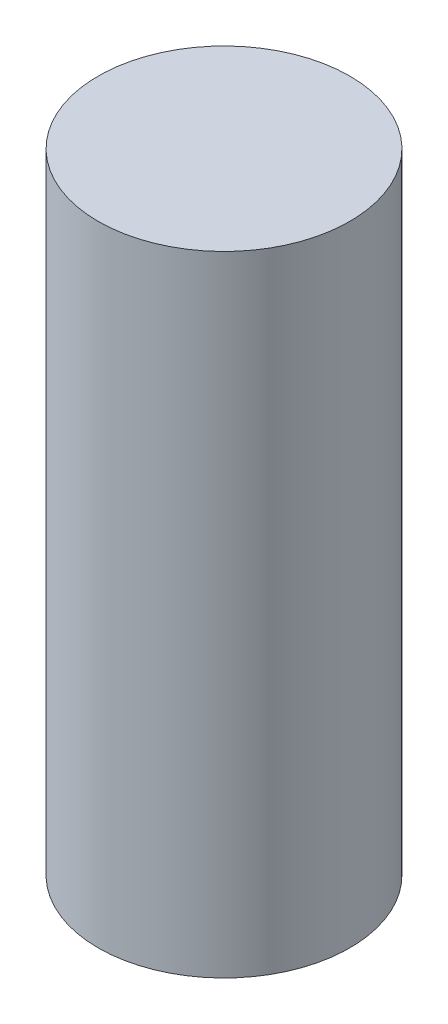
ISO-10303-21;
HEADER;
FILE_DESCRIPTION(('STEP AP214'),'2;1');
FILE_NAME('part.step','',(''),(''),'','','');
FILE_SCHEMA(('AUTOMOTIVE_DESIGN { 1 0 10303 214 1 1 1 1 }'));
ENDSEC;
DATA;
#1=APPLICATION_CONTEXT('core data for automotive mechanical design processes');
#2=APPLICATION_PROTOCOL_DEFINITION('international standard','automotive_design',2000,#1);
#3=PRODUCT_CONTEXT('',#1,'mechanical');
#4=PRODUCT('Part','Part','',(#3));
#5=PRODUCT_RELATED_PRODUCT_CATEGORY('part','',(#4));
#6=PRODUCT_DEFINITION_FORMATION('','',#4);
#7=PRODUCT_DEFINITION_CONTEXT('part definition',#1,'design');
#8=PRODUCT_DEFINITION('design','',#6,#7);
#9=PRODUCT_DEFINITION_SHAPE('','',#8);
#10=(LENGTH_UNIT() NAMED_UNIT(*) SI_UNIT(.MILLI.,.METRE.));
#11=(NAMED_UNIT(*) PLANE_ANGLE_UNIT() SI_UNIT($,.RADIAN.));
#12=(NAMED_UNIT(*) SI_UNIT($,.STERADIAN.) SOLID_ANGLE_UNIT());
#13=UNCERTAINTY_MEASURE_WITH_UNIT(LENGTH_MEASURE(1.E-05),#10,'distance_accuracy_value','');
#14=(GEOMETRIC_REPRESENTATION_CONTEXT(3) GLOBAL_UNCERTAINTY_ASSIGNED_CONTEXT((#13)) GLOBAL_UNIT_ASSIGNED_CONTEXT((#10,
#11,#12)) REPRESENTATION_CONTEXT('',''));
#15=CARTESIAN_POINT('',(0.,0.,0.));
#16=DIRECTION('',(0.,0.,1.));
#17=DIRECTION('',(1.,0.,0.));
#18=AXIS2_PLACEMENT_3D('',#15,#16,#17);
#19=CARTESIAN_POINT('',(0.,100.,0.));
#20=DIRECTION('',(0.,-1.,0.));
#21=DIRECTION('',(0.,0.,-1.));
#22=AXIS2_PLACEMENT_3D('',#19,#20,#21);
#23=CYLINDRICAL_SURFACE('',#22,20.);
#24=CARTESIAN_POINT('',(0.,100.,0.));
#25=DIRECTION('',(0.,1.,0.));
#26=DIRECTION('',(0.,0.,1.));
#27=AXIS2_PLACEMENT_3D('',#24,#25,#26);
#28=CIRCLE('',#27,20.);
#29=CARTESIAN_POINT('',(0.,100.,20.));
#30=VERTEX_POINT('',#29);
#31=EDGE_CURVE('E10',#30,#30,#28,.T.);
#32=ORIENTED_EDGE('',*,*,#31,.F.);
#33=EDGE_LOOP('',(#32));
#34=FACE_BOUND('',#33,.T.);
#35=CARTESIAN_POINT('',(0.,0.,0.));
#36=DIRECTION('',(0.,1.,0.));
#37=DIRECTION('',(0.,0.,1.));
#38=AXIS2_PLACEMENT_3D('',#35,#36,#37);
#39=CIRCLE('',#38,20.);
#40=CARTESIAN_POINT('',(0.,0.,20.));
#41=VERTEX_POINT('',#40);
#42=EDGE_CURVE('E46',#41,#41,#39,.T.);
#43=ORIENTED_EDGE('',*,*,#42,.T.);
#44=EDGE_LOOP('',(#43));
#45=FACE_BOUND('',#44,.T.);
#46=ADVANCED_FACE('F43',(#34,#45),#23,.T.);
#47=CARTESIAN_POINT('',(0.,100.,0.));
#48=DIRECTION('',(0.,1.,0.));
#49=DIRECTION('',(0.,0.,1.));
#50=AXIS2_PLACEMENT_3D('',#47,#48,#49);
#51=PLANE('',#50);
#52=ORIENTED_EDGE('',*,*,#31,.T.);
#53=EDGE_LOOP('',(#52));
#54=FACE_BOUND('',#53,.T.);
#55=ADVANCED_FACE('F76',(#54),#51,.T.);
#56=CARTESIAN_POINT('',(0.,0.,0.));
#57=DIRECTION('',(0.,1.,0.));
#58=DIRECTION('',(0.,0.,1.));
#59=AXIS2_PLACEMENT_3D('',#56,#57,#58);
#60=PLANE('',#59);
#61=CARTESIAN_POINT('',(0.,0.,0.));
#62=DIRECTION('',(0.,-1.,0.));
#63=DIRECTION('',(0.,0.,-1.));
#64=AXIS2_PLACEMENT_3D('',#61,#62,#63);
#65=CIRCLE('',#64,10.);
#66=CARTESIAN_POINT('',(0.,0.,-10.));
#67=VERTEX_POINT('',#66);
#68=EDGE_CURVE('E57',#67,#67,#65,.T.);
#69=ORIENTED_EDGE('',*,*,#68,.F.);
#70=EDGE_LOOP('',(#69));
#71=FACE_BOUND('',#70,.T.);
#72=ORIENTED_EDGE('',*,*,#42,.F.);
#73=EDGE_LOOP('',(#72));
#74=FACE_BOUND('',#73,.T.);
#75=ADVANCED_FACE('F70',(#71,#74),#60,.F.);
#76=CARTESIAN_POINT('',(0.,20.,0.));
#77=DIRECTION('',(0.,-1.,0.));
#78=DIRECTION('',(0.,0.,-1.));
#79=AXIS2_PLACEMENT_3D('',#76,#77,#78);
#80=CYLINDRICAL_SURFACE('',#79,10.);
#81=CARTESIAN_POINT('',(0.,20.,0.));
#82=DIRECTION('',(0.,-1.,0.));
#83=DIRECTION('',(0.,0.,-1.));
#84=AXIS2_PLACEMENT_3D('',#81,#82,#83);
#85=CIRCLE('',#84,10.);
#86=CARTESIAN_POINT('',(0.,20.,-10.));
#87=VERTEX_POINT('',#86);
#88=EDGE_CURVE('E55',#87,#87,#85,.T.);
#89=ORIENTED_EDGE('',*,*,#88,.F.);
#90=EDGE_LOOP('',(#89));
#91=FACE_BOUND('',#90,.T.);
#92=ORIENTED_EDGE('',*,*,#68,.T.);
#93=EDGE_LOOP('',(#92));
#94=FACE_BOUND('',#93,.T.);
#95=ADVANCED_FACE('F67',(#91,#94),#80,.F.);
#96=CARTESIAN_POINT('',(0.,20.,0.));
#97=DIRECTION('',(0.,-1.,0.));
#98=DIRECTION('',(0.,0.,-1.));
#99=AXIS2_PLACEMENT_3D('',#96,#97,#98);
#100=PLANE('',#99);
#101=ORIENTED_EDGE('',*,*,#88,.T.);
#102=EDGE_LOOP('',(#101));
#103=FACE_BOUND('',#102,.T.);
#104=ADVANCED_FACE('F65',(#103),#100,.T.);
#105=CLOSED_SHELL('',(#46,#55,#75,#95,#104));
#106=MANIFOLD_SOLID_BREP('B2',#105);
#107=ADVANCED_BREP_SHAPE_REPRESENTATION('',(#18,#106),#14);
#108=SHAPE_DEFINITION_REPRESENTATION(#9,#107);
ENDSEC;
END-ISO-10303-21;
